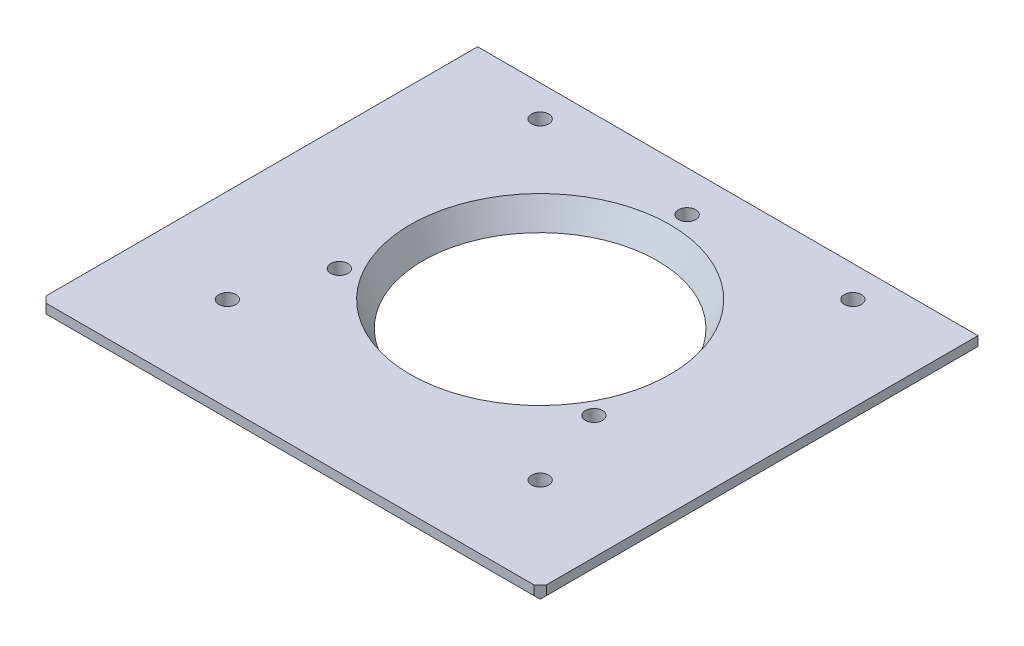
ISO-10303-21;
HEADER;
FILE_DESCRIPTION(('STEP AP214'),'2;1');
FILE_NAME('part.step','',(''),(''),'','','');
FILE_SCHEMA(('AUTOMOTIVE_DESIGN { 1 0 10303 214 1 1 1 1 }'));
ENDSEC;
DATA;
#1=APPLICATION_CONTEXT('core data for automotive mechanical design processes');
#2=APPLICATION_PROTOCOL_DEFINITION('international standard','automotive_design',2000,#1);
#3=PRODUCT_CONTEXT('',#1,'mechanical');
#4=PRODUCT('Part','Part','',(#3));
#5=PRODUCT_RELATED_PRODUCT_CATEGORY('part','',(#4));
#6=PRODUCT_DEFINITION_FORMATION('','',#4);
#7=PRODUCT_DEFINITION_CONTEXT('part definition',#1,'design');
#8=PRODUCT_DEFINITION('design','',#6,#7);
#9=PRODUCT_DEFINITION_SHAPE('','',#8);
#10=(LENGTH_UNIT() NAMED_UNIT(*) SI_UNIT(.MILLI.,.METRE.));
#11=(NAMED_UNIT(*) PLANE_ANGLE_UNIT() SI_UNIT($,.RADIAN.));
#12=(NAMED_UNIT(*) SI_UNIT($,.STERADIAN.) SOLID_ANGLE_UNIT());
#13=UNCERTAINTY_MEASURE_WITH_UNIT(LENGTH_MEASURE(1.E-05),#10,'distance_accuracy_value','');
#14=(GEOMETRIC_REPRESENTATION_CONTEXT(3) GLOBAL_UNCERTAINTY_ASSIGNED_CONTEXT((#13)) GLOBAL_UNIT_ASSIGNED_CONTEXT((#10,
#11,#12)) REPRESENTATION_CONTEXT('',''));
#15=CARTESIAN_POINT('',(0.,0.,0.));
#16=DIRECTION('',(0.,0.,1.));
#17=DIRECTION('',(1.,0.,0.));
#18=AXIS2_PLACEMENT_3D('',#15,#16,#17);
#19=CARTESIAN_POINT('',(40.,4.,0.));
#20=DIRECTION('',(-1.,0.,0.));
#21=DIRECTION('',(0.,0.,1.));
#22=AXIS2_PLACEMENT_3D('',#19,#20,#21);
#23=PLANE('',#22);
#24=DIRECTION('',(0.,-1.,0.));
#25=VECTOR('',#24,1.);
#26=CARTESIAN_POINT('',(40.,4.,39.));
#27=LINE('',#26,#25);
#28=CARTESIAN_POINT('',(40.,4.,39.));
#29=VERTEX_POINT('',#28);
#30=CARTESIAN_POINT('',(40.,2.5,39.));
#31=VERTEX_POINT('',#30);
#32=EDGE_CURVE('E220',#29,#31,#27,.T.);
#33=ORIENTED_EDGE('',*,*,#32,.T.);
#34=DIRECTION('',(0.,0.,-1.));
#35=VECTOR('',#34,1.);
#36=CARTESIAN_POINT('',(40.,2.5,0.));
#37=LINE('',#36,#35);
#38=CARTESIAN_POINT('',(40.,2.5,-30.));
#39=VERTEX_POINT('',#38);
#40=EDGE_CURVE('E140',#31,#39,#37,.T.);
#41=ORIENTED_EDGE('',*,*,#40,.T.);
#42=DIRECTION('',(0.,-1.,0.));
#43=VECTOR('',#42,1.);
#44=CARTESIAN_POINT('',(40.,4.,-30.));
#45=LINE('',#44,#43);
#46=CARTESIAN_POINT('',(40.,4.,-30.));
#47=VERTEX_POINT('',#46);
#48=EDGE_CURVE('E138',#47,#39,#45,.T.);
#49=ORIENTED_EDGE('',*,*,#48,.F.);
#50=DIRECTION('',(0.,0.,-1.));
#51=VECTOR('',#50,1.);
#52=CARTESIAN_POINT('',(40.,4.,0.));
#53=LINE('',#52,#51);
#54=EDGE_CURVE('E120',#29,#47,#53,.T.);
#55=ORIENTED_EDGE('',*,*,#54,.F.);
#56=EDGE_LOOP('',(#33,#41,#49,#55));
#57=FACE_BOUND('',#56,.T.);
#58=ADVANCED_FACE('F46',(#57),#23,.F.);
#59=CARTESIAN_POINT('',(0.,4.,-30.));
#60=DIRECTION('',(0.,0.,-1.));
#61=DIRECTION('',(-1.,0.,0.));
#62=AXIS2_PLACEMENT_3D('',#59,#60,#61);
#63=PLANE('',#62);
#64=ORIENTED_EDGE('',*,*,#48,.T.);
#65=DIRECTION('',(0.707106781186549,0.707106781186546,0.));
#66=VECTOR('',#65,1.);
#67=CARTESIAN_POINT('',(20.7499999999999,-16.75,-30.));
#68=LINE('',#67,#66);
#69=CARTESIAN_POINT('',(37.5,0.,-30.));
#70=VERTEX_POINT('',#69);
#71=EDGE_CURVE('E243',#39,#70,#68,.F.);
#72=ORIENTED_EDGE('',*,*,#71,.T.);
#73=DIRECTION('',(1.,0.,0.));
#74=VECTOR('',#73,1.);
#75=CARTESIAN_POINT('',(0.,0.,-30.));
#76=LINE('',#75,#74);
#77=CARTESIAN_POINT('',(-37.5,0.,-30.));
#78=VERTEX_POINT('',#77);
#79=EDGE_CURVE('E162',#78,#70,#76,.T.);
#80=ORIENTED_EDGE('',*,*,#79,.F.);
#81=DIRECTION('',(-0.707106781186548,0.707106781186548,0.));
#82=VECTOR('',#81,1.);
#83=CARTESIAN_POINT('',(-20.75,-16.75,-30.));
#84=LINE('',#83,#82);
#85=CARTESIAN_POINT('',(-40.,2.50000000000002,-30.));
#86=VERTEX_POINT('',#85);
#87=EDGE_CURVE('E240',#78,#86,#84,.T.);
#88=ORIENTED_EDGE('',*,*,#87,.T.);
#89=DIRECTION('',(0.,-1.,0.));
#90=VECTOR('',#89,1.);
#91=CARTESIAN_POINT('',(-40.,4.,-30.));
#92=LINE('',#91,#90);
#93=CARTESIAN_POINT('',(-40.,4.,-30.));
#94=VERTEX_POINT('',#93);
#95=EDGE_CURVE('E144',#94,#86,#92,.T.);
#96=ORIENTED_EDGE('',*,*,#95,.F.);
#97=DIRECTION('',(1.,0.,0.));
#98=VECTOR('',#97,1.);
#99=CARTESIAN_POINT('',(0.,4.,-30.));
#100=LINE('',#99,#98);
#101=EDGE_CURVE('E127',#94,#47,#100,.T.);
#102=ORIENTED_EDGE('',*,*,#101,.T.);
#103=EDGE_LOOP('',(#64,#72,#80,#88,#96,#102));
#104=FACE_BOUND('',#103,.T.);
#105=ADVANCED_FACE('F147',(#104),#63,.T.);
#106=CARTESIAN_POINT('',(-40.,4.,0.));
#107=DIRECTION('',(-1.,0.,0.));
#108=DIRECTION('',(0.,0.,1.));
#109=AXIS2_PLACEMENT_3D('',#106,#107,#108);
#110=PLANE('',#109);
#111=ORIENTED_EDGE('',*,*,#95,.T.);
#112=DIRECTION('',(0.,0.,1.));
#113=VECTOR('',#112,1.);
#114=CARTESIAN_POINT('',(-40.,2.50000000000002,39.));
#115=LINE('',#114,#113);
#116=CARTESIAN_POINT('',(-40.,2.50000000000002,39.));
#117=VERTEX_POINT('',#116);
#118=EDGE_CURVE('E11',#86,#117,#115,.T.);
#119=ORIENTED_EDGE('',*,*,#118,.T.);
#120=DIRECTION('',(0.,1.,0.));
#121=VECTOR('',#120,1.);
#122=CARTESIAN_POINT('',(-40.,4.,39.));
#123=LINE('',#122,#121);
#124=CARTESIAN_POINT('',(-40.,4.,39.));
#125=VERTEX_POINT('',#124);
#126=EDGE_CURVE('E235',#117,#125,#123,.T.);
#127=ORIENTED_EDGE('',*,*,#126,.T.);
#128=DIRECTION('',(0.,0.,-1.));
#129=VECTOR('',#128,1.);
#130=CARTESIAN_POINT('',(-40.,4.,0.));
#131=LINE('',#130,#129);
#132=EDGE_CURVE('E149',#125,#94,#131,.T.);
#133=ORIENTED_EDGE('',*,*,#132,.T.);
#134=EDGE_LOOP('',(#111,#119,#127,#133));
#135=FACE_BOUND('',#134,.T.);
#136=ADVANCED_FACE('F299',(#135),#110,.T.);
#137=CARTESIAN_POINT('',(0.,4.,-23.5));
#138=DIRECTION('',(0.,-1.,0.));
#139=DIRECTION('',(0.,0.,-1.));
#140=AXIS2_PLACEMENT_3D('',#137,#138,#139);
#141=CYLINDRICAL_SURFACE('',#140,1.375);
#142=CARTESIAN_POINT('',(0.,1.,-23.5));
#143=DIRECTION('',(0.,1.,0.));
#144=DIRECTION('',(0.,0.,1.));
#145=AXIS2_PLACEMENT_3D('',#142,#143,#144);
#146=CIRCLE('',#145,1.375);
#147=CARTESIAN_POINT('',(0.,1.,-22.125));
#148=VERTEX_POINT('',#147);
#149=EDGE_CURVE('E180',#148,#148,#146,.T.);
#150=ORIENTED_EDGE('',*,*,#149,.F.);
#151=EDGE_LOOP('',(#150));
#152=FACE_BOUND('',#151,.T.);
#153=CARTESIAN_POINT('',(0.,4.,-23.5));
#154=DIRECTION('',(0.,1.,0.));
#155=DIRECTION('',(0.,0.,1.));
#156=AXIS2_PLACEMENT_3D('',#153,#154,#155);
#157=CIRCLE('',#156,1.375);
#158=CARTESIAN_POINT('',(0.,4.,-22.125));
#159=VERTEX_POINT('',#158);
#160=EDGE_CURVE('E158',#159,#159,#157,.T.);
#161=ORIENTED_EDGE('',*,*,#160,.T.);
#162=EDGE_LOOP('',(#161));
#163=FACE_BOUND('',#162,.T.);
#164=ADVANCED_FACE('F301',(#152,#163),#141,.F.);
#165=CARTESIAN_POINT('',(0.,4.,40.));
#166=DIRECTION('',(0.,0.,-1.));
#167=DIRECTION('',(-1.,0.,0.));
#168=AXIS2_PLACEMENT_3D('',#165,#166,#167);
#169=PLANE('',#168);
#170=DIRECTION('',(0.,-1.,0.));
#171=VECTOR('',#170,1.);
#172=CARTESIAN_POINT('',(-39.,0.,40.));
#173=LINE('',#172,#171);
#174=CARTESIAN_POINT('',(-39.,4.,40.));
#175=VERTEX_POINT('',#174);
#176=CARTESIAN_POINT('',(-39.,2.5,40.));
#177=VERTEX_POINT('',#176);
#178=EDGE_CURVE('E223',#175,#177,#173,.T.);
#179=ORIENTED_EDGE('',*,*,#178,.T.);
#180=DIRECTION('',(1.,0.,0.));
#181=VECTOR('',#180,1.);
#182=CARTESIAN_POINT('',(0.,2.5,40.));
#183=LINE('',#182,#181);
#184=CARTESIAN_POINT('',(39.,2.5,40.));
#185=VERTEX_POINT('',#184);
#186=EDGE_CURVE('E261',#177,#185,#183,.T.);
#187=ORIENTED_EDGE('',*,*,#186,.T.);
#188=DIRECTION('',(0.,1.,0.));
#189=VECTOR('',#188,1.);
#190=CARTESIAN_POINT('',(39.,4.,40.));
#191=LINE('',#190,#189);
#192=CARTESIAN_POINT('',(39.,4.,40.));
#193=VERTEX_POINT('',#192);
#194=EDGE_CURVE('E227',#185,#193,#191,.T.);
#195=ORIENTED_EDGE('',*,*,#194,.T.);
#196=DIRECTION('',(1.,0.,0.));
#197=VECTOR('',#196,1.);
#198=CARTESIAN_POINT('',(0.,4.,40.));
#199=LINE('',#198,#197);
#200=EDGE_CURVE('E152',#175,#193,#199,.T.);
#201=ORIENTED_EDGE('',*,*,#200,.F.);
#202=EDGE_LOOP('',(#179,#187,#195,#201));
#203=FACE_BOUND('',#202,.T.);
#204=ADVANCED_FACE('F294',(#203),#169,.F.);
#205=CARTESIAN_POINT('',(-20.3515969889343,4.,11.75));
#206=DIRECTION('',(0.,-1.,0.));
#207=DIRECTION('',(0.,0.,-1.));
#208=AXIS2_PLACEMENT_3D('',#205,#206,#207);
#209=CYLINDRICAL_SURFACE('',#208,1.375);
#210=CARTESIAN_POINT('',(-20.3515969889343,1.,11.75));
#211=DIRECTION('',(0.,1.,0.));
#212=DIRECTION('',(0.,0.,1.));
#213=AXIS2_PLACEMENT_3D('',#210,#211,#212);
#214=CIRCLE('',#213,1.375);
#215=CARTESIAN_POINT('',(-20.3515969889343,1.,13.125));
#216=VERTEX_POINT('',#215);
#217=EDGE_CURVE('E176',#216,#216,#214,.T.);
#218=ORIENTED_EDGE('',*,*,#217,.F.);
#219=EDGE_LOOP('',(#218));
#220=FACE_BOUND('',#219,.T.);
#221=CARTESIAN_POINT('',(-20.3515969889343,4.,11.75));
#222=DIRECTION('',(0.,1.,0.));
#223=DIRECTION('',(0.,0.,1.));
#224=AXIS2_PLACEMENT_3D('',#221,#222,#223);
#225=CIRCLE('',#224,1.375);
#226=CARTESIAN_POINT('',(-20.3515969889343,4.,13.125));
#227=VERTEX_POINT('',#226);
#228=EDGE_CURVE('E134',#227,#227,#225,.T.);
#229=ORIENTED_EDGE('',*,*,#228,.T.);
#230=EDGE_LOOP('',(#229));
#231=FACE_BOUND('',#230,.T.);
#232=ADVANCED_FACE('F318',(#220,#231),#209,.F.);
#233=CARTESIAN_POINT('',(20.3515969889343,4.,11.7500000000001));
#234=DIRECTION('',(0.,-1.,0.));
#235=DIRECTION('',(0.,0.,-1.));
#236=AXIS2_PLACEMENT_3D('',#233,#234,#235);
#237=CYLINDRICAL_SURFACE('',#236,1.375);
#238=CARTESIAN_POINT('',(20.3515969889343,1.,11.7500000000001));
#239=DIRECTION('',(0.,1.,0.));
#240=DIRECTION('',(0.,0.,1.));
#241=AXIS2_PLACEMENT_3D('',#238,#239,#240);
#242=CIRCLE('',#241,1.375);
#243=CARTESIAN_POINT('',(20.3515969889343,1.,13.1250000000001));
#244=VERTEX_POINT('',#243);
#245=EDGE_CURVE('E184',#244,#244,#242,.T.);
#246=ORIENTED_EDGE('',*,*,#245,.F.);
#247=EDGE_LOOP('',(#246));
#248=FACE_BOUND('',#247,.T.);
#249=CARTESIAN_POINT('',(20.3515969889343,4.,11.7500000000001));
#250=DIRECTION('',(0.,1.,0.));
#251=DIRECTION('',(0.,0.,1.));
#252=AXIS2_PLACEMENT_3D('',#249,#250,#251);
#253=CIRCLE('',#252,1.375);
#254=CARTESIAN_POINT('',(20.3515969889343,4.,13.1250000000001));
#255=VERTEX_POINT('',#254);
#256=EDGE_CURVE('E664',#255,#255,#253,.T.);
#257=ORIENTED_EDGE('',*,*,#256,.T.);
#258=EDGE_LOOP('',(#257));
#259=FACE_BOUND('',#258,.T.);
#260=ADVANCED_FACE('F321',(#248,#259),#237,.F.);
#261=CARTESIAN_POINT('',(-25.,4.,25.));
#262=DIRECTION('',(0.,-1.,0.));
#263=DIRECTION('',(0.,0.,-1.));
#264=AXIS2_PLACEMENT_3D('',#261,#262,#263);
#265=CYLINDRICAL_SURFACE('',#264,1.375);
#266=CARTESIAN_POINT('',(-25.,0.5,25.));
#267=DIRECTION('',(0.,1.,0.));
#268=DIRECTION('',(0.,0.,1.));
#269=AXIS2_PLACEMENT_3D('',#266,#267,#268);
#270=CIRCLE('',#269,1.375);
#271=CARTESIAN_POINT('',(-25.,0.5,26.375));
#272=VERTEX_POINT('',#271);
#273=EDGE_CURVE('E204',#272,#272,#270,.F.);
#274=ORIENTED_EDGE('',*,*,#273,.T.);
#275=EDGE_LOOP('',(#274));
#276=FACE_BOUND('',#275,.T.);
#277=CARTESIAN_POINT('',(-25.,4.,25.));
#278=DIRECTION('',(0.,1.,0.));
#279=DIRECTION('',(0.,0.,1.));
#280=AXIS2_PLACEMENT_3D('',#277,#278,#279);
#281=CIRCLE('',#280,1.375);
#282=CARTESIAN_POINT('',(-25.,4.,26.375));
#283=VERTEX_POINT('',#282);
#284=EDGE_CURVE('E660',#283,#283,#281,.T.);
#285=ORIENTED_EDGE('',*,*,#284,.T.);
#286=EDGE_LOOP('',(#285));
#287=FACE_BOUND('',#286,.T.);
#288=ADVANCED_FACE('F325',(#276,#287),#265,.F.);
#289=CARTESIAN_POINT('',(-25.,4.,-25.));
#290=DIRECTION('',(0.,-1.,0.));
#291=DIRECTION('',(0.,0.,-1.));
#292=AXIS2_PLACEMENT_3D('',#289,#290,#291);
#293=CYLINDRICAL_SURFACE('',#292,1.375);
#294=CARTESIAN_POINT('',(-25.,0.5,-25.));
#295=DIRECTION('',(0.,1.,0.));
#296=DIRECTION('',(0.,0.,1.));
#297=AXIS2_PLACEMENT_3D('',#294,#295,#296);
#298=CIRCLE('',#297,1.375);
#299=CARTESIAN_POINT('',(-25.,0.5,-23.625));
#300=VERTEX_POINT('',#299);
#301=EDGE_CURVE('E212',#300,#300,#298,.F.);
#302=ORIENTED_EDGE('',*,*,#301,.T.);
#303=EDGE_LOOP('',(#302));
#304=FACE_BOUND('',#303,.T.);
#305=CARTESIAN_POINT('',(-25.,4.,-25.));
#306=DIRECTION('',(0.,1.,0.));
#307=DIRECTION('',(0.,0.,1.));
#308=AXIS2_PLACEMENT_3D('',#305,#306,#307);
#309=CIRCLE('',#308,1.375);
#310=CARTESIAN_POINT('',(-25.,4.,-23.625));
#311=VERTEX_POINT('',#310);
#312=EDGE_CURVE('E656',#311,#311,#309,.T.);
#313=ORIENTED_EDGE('',*,*,#312,.T.);
#314=EDGE_LOOP('',(#313));
#315=FACE_BOUND('',#314,.T.);
#316=ADVANCED_FACE('F329',(#304,#315),#293,.F.);
#317=CARTESIAN_POINT('',(25.,4.,-25.));
#318=DIRECTION('',(0.,-1.,0.));
#319=DIRECTION('',(0.,0.,-1.));
#320=AXIS2_PLACEMENT_3D('',#317,#318,#319);
#321=CYLINDRICAL_SURFACE('',#320,1.375);
#322=CARTESIAN_POINT('',(25.,0.5,-25.));
#323=DIRECTION('',(0.,1.,0.));
#324=DIRECTION('',(0.,0.,1.));
#325=AXIS2_PLACEMENT_3D('',#322,#323,#324);
#326=CIRCLE('',#325,1.375);
#327=CARTESIAN_POINT('',(25.,0.5,-23.625));
#328=VERTEX_POINT('',#327);
#329=EDGE_CURVE('E216',#328,#328,#326,.F.);
#330=ORIENTED_EDGE('',*,*,#329,.T.);
#331=EDGE_LOOP('',(#330));
#332=FACE_BOUND('',#331,.T.);
#333=CARTESIAN_POINT('',(25.,4.,-25.));
#334=DIRECTION('',(0.,1.,0.));
#335=DIRECTION('',(0.,0.,1.));
#336=AXIS2_PLACEMENT_3D('',#333,#334,#335);
#337=CIRCLE('',#336,1.375);
#338=CARTESIAN_POINT('',(25.,4.,-23.625));
#339=VERTEX_POINT('',#338);
#340=EDGE_CURVE('E652',#339,#339,#337,.T.);
#341=ORIENTED_EDGE('',*,*,#340,.T.);
#342=EDGE_LOOP('',(#341));
#343=FACE_BOUND('',#342,.T.);
#344=ADVANCED_FACE('F333',(#332,#343),#321,.F.);
#345=CARTESIAN_POINT('',(25.,4.,25.));
#346=DIRECTION('',(0.,-1.,0.));
#347=DIRECTION('',(0.,0.,-1.));
#348=AXIS2_PLACEMENT_3D('',#345,#346,#347);
#349=CYLINDRICAL_SURFACE('',#348,1.375);
#350=CARTESIAN_POINT('',(25.,0.5,25.));
#351=DIRECTION('',(0.,1.,0.));
#352=DIRECTION('',(0.,0.,1.));
#353=AXIS2_PLACEMENT_3D('',#350,#351,#352);
#354=CIRCLE('',#353,1.375);
#355=CARTESIAN_POINT('',(25.,0.5,26.375));
#356=VERTEX_POINT('',#355);
#357=EDGE_CURVE('E208',#356,#356,#354,.F.);
#358=ORIENTED_EDGE('',*,*,#357,.T.);
#359=EDGE_LOOP('',(#358));
#360=FACE_BOUND('',#359,.T.);
#361=CARTESIAN_POINT('',(25.,4.,25.));
#362=DIRECTION('',(0.,1.,0.));
#363=DIRECTION('',(0.,0.,1.));
#364=AXIS2_PLACEMENT_3D('',#361,#362,#363);
#365=CIRCLE('',#364,1.375);
#366=CARTESIAN_POINT('',(25.,4.,26.375));
#367=VERTEX_POINT('',#366);
#368=EDGE_CURVE('E170',#367,#367,#365,.T.);
#369=ORIENTED_EDGE('',*,*,#368,.T.);
#370=EDGE_LOOP('',(#369));
#371=FACE_BOUND('',#370,.T.);
#372=ADVANCED_FACE('F337',(#360,#371),#349,.F.);
#373=CARTESIAN_POINT('',(0.,4.,0.));
#374=DIRECTION('',(0.,1.,0.));
#375=DIRECTION('',(0.,0.,1.));
#376=AXIS2_PLACEMENT_3D('',#373,#374,#375);
#377=PLANE('',#376);
#378=CARTESIAN_POINT('',(0.,4.,0.));
#379=DIRECTION('',(0.,1.,0.));
#380=DIRECTION('',(0.,0.,1.));
#381=AXIS2_PLACEMENT_3D('',#378,#379,#380);
#382=CIRCLE('',#381,20.75);
#383=CARTESIAN_POINT('',(0.,4.,20.75));
#384=VERTEX_POINT('',#383);
#385=EDGE_CURVE('E143',#384,#384,#382,.F.);
#386=ORIENTED_EDGE('',*,*,#385,.T.);
#387=EDGE_LOOP('',(#386));
#388=FACE_BOUND('',#387,.T.);
#389=ORIENTED_EDGE('',*,*,#368,.F.);
#390=EDGE_LOOP('',(#389));
#391=FACE_BOUND('',#390,.T.);
#392=ORIENTED_EDGE('',*,*,#340,.F.);
#393=EDGE_LOOP('',(#392));
#394=FACE_BOUND('',#393,.T.);
#395=ORIENTED_EDGE('',*,*,#312,.F.);
#396=EDGE_LOOP('',(#395));
#397=FACE_BOUND('',#396,.T.);
#398=ORIENTED_EDGE('',*,*,#284,.F.);
#399=EDGE_LOOP('',(#398));
#400=FACE_BOUND('',#399,.T.);
#401=ORIENTED_EDGE('',*,*,#256,.F.);
#402=EDGE_LOOP('',(#401));
#403=FACE_BOUND('',#402,.T.);
#404=ORIENTED_EDGE('',*,*,#228,.F.);
#405=EDGE_LOOP('',(#404));
#406=FACE_BOUND('',#405,.T.);
#407=ORIENTED_EDGE('',*,*,#200,.T.);
#408=DIRECTION('',(-0.707106781186552,0.,0.707106781186543));
#409=VECTOR('',#408,1.);
#410=CARTESIAN_POINT('',(39.4999999999997,4.,39.5000000000003));
#411=LINE('',#410,#409);
#412=EDGE_CURVE('E129',#193,#29,#411,.F.);
#413=ORIENTED_EDGE('',*,*,#412,.T.);
#414=ORIENTED_EDGE('',*,*,#54,.T.);
#415=ORIENTED_EDGE('',*,*,#101,.F.);
#416=ORIENTED_EDGE('',*,*,#132,.F.);
#417=DIRECTION('',(0.707106781186543,0.,0.707106781186552));
#418=VECTOR('',#417,1.);
#419=CARTESIAN_POINT('',(-39.5000000000003,4.,39.4999999999997));
#420=LINE('',#419,#418);
#421=EDGE_CURVE('E230',#125,#175,#420,.T.);
#422=ORIENTED_EDGE('',*,*,#421,.T.);
#423=EDGE_LOOP('',(#407,#413,#414,#415,#416,#422));
#424=FACE_BOUND('',#423,.T.);
#425=ORIENTED_EDGE('',*,*,#160,.F.);
#426=EDGE_LOOP('',(#425));
#427=FACE_BOUND('',#426,.T.);
#428=ADVANCED_FACE('F123',(#388,#391,#394,#397,#400,#403,#406,#424,#427),#377,.T.);
#429=CARTESIAN_POINT('',(0.,0.,0.));
#430=DIRECTION('',(0.,1.,0.));
#431=DIRECTION('',(0.,0.,1.));
#432=AXIS2_PLACEMENT_3D('',#429,#430,#431);
#433=PLANE('',#432);
#434=CARTESIAN_POINT('',(-25.,0.,25.));
#435=DIRECTION('',(0.,1.,0.));
#436=DIRECTION('',(0.,0.,1.));
#437=AXIS2_PLACEMENT_3D('',#434,#435,#436);
#438=CIRCLE('',#437,1.875);
#439=CARTESIAN_POINT('',(-25.,0.,26.875));
#440=VERTEX_POINT('',#439);
#441=EDGE_CURVE('E200',#440,#440,#438,.T.);
#442=ORIENTED_EDGE('',*,*,#441,.T.);
#443=EDGE_LOOP('',(#442));
#444=FACE_BOUND('',#443,.T.);
#445=CARTESIAN_POINT('',(25.,0.,25.));
#446=DIRECTION('',(0.,1.,0.));
#447=DIRECTION('',(0.,0.,1.));
#448=AXIS2_PLACEMENT_3D('',#445,#446,#447);
#449=CIRCLE('',#448,1.875);
#450=CARTESIAN_POINT('',(25.,0.,26.875));
#451=VERTEX_POINT('',#450);
#452=EDGE_CURVE('E196',#451,#451,#449,.T.);
#453=ORIENTED_EDGE('',*,*,#452,.T.);
#454=EDGE_LOOP('',(#453));
#455=FACE_BOUND('',#454,.T.);
#456=CARTESIAN_POINT('',(-25.,0.,-25.));
#457=DIRECTION('',(0.,1.,0.));
#458=DIRECTION('',(0.,0.,1.));
#459=AXIS2_PLACEMENT_3D('',#456,#457,#458);
#460=CIRCLE('',#459,1.875);
#461=CARTESIAN_POINT('',(-25.,0.,-23.125));
#462=VERTEX_POINT('',#461);
#463=EDGE_CURVE('E192',#462,#462,#460,.T.);
#464=ORIENTED_EDGE('',*,*,#463,.T.);
#465=EDGE_LOOP('',(#464));
#466=FACE_BOUND('',#465,.T.);
#467=CARTESIAN_POINT('',(25.,0.,-25.));
#468=DIRECTION('',(0.,1.,0.));
#469=DIRECTION('',(0.,0.,1.));
#470=AXIS2_PLACEMENT_3D('',#467,#468,#469);
#471=CIRCLE('',#470,1.875);
#472=CARTESIAN_POINT('',(25.,0.,-23.125));
#473=VERTEX_POINT('',#472);
#474=EDGE_CURVE('E188',#473,#473,#471,.T.);
#475=ORIENTED_EDGE('',*,*,#474,.T.);
#476=EDGE_LOOP('',(#475));
#477=FACE_BOUND('',#476,.T.);
#478=ORIENTED_EDGE('',*,*,#79,.T.);
#479=DIRECTION('',(0.,0.,1.));
#480=VECTOR('',#479,1.);
#481=CARTESIAN_POINT('',(37.5,0.,0.));
#482=LINE('',#481,#480);
#483=CARTESIAN_POINT('',(37.5,0.,37.5));
#484=VERTEX_POINT('',#483);
#485=EDGE_CURVE('E252',#70,#484,#482,.T.);
#486=ORIENTED_EDGE('',*,*,#485,.T.);
#487=DIRECTION('',(-1.,0.,0.));
#488=VECTOR('',#487,1.);
#489=CARTESIAN_POINT('',(0.,0.,37.5));
#490=LINE('',#489,#488);
#491=CARTESIAN_POINT('',(-37.5,0.,37.5));
#492=VERTEX_POINT('',#491);
#493=EDGE_CURVE('E249',#484,#492,#490,.T.);
#494=ORIENTED_EDGE('',*,*,#493,.T.);
#495=DIRECTION('',(0.,0.,-1.));
#496=VECTOR('',#495,1.);
#497=CARTESIAN_POINT('',(-37.5,0.,-30.));
#498=LINE('',#497,#496);
#499=EDGE_CURVE('E246',#492,#78,#498,.T.);
#500=ORIENTED_EDGE('',*,*,#499,.T.);
#501=EDGE_LOOP('',(#478,#486,#494,#500));
#502=FACE_BOUND('',#501,.T.);
#503=CARTESIAN_POINT('',(0.,0.,0.));
#504=DIRECTION('',(0.,1.,0.));
#505=DIRECTION('',(0.,0.,1.));
#506=AXIS2_PLACEMENT_3D('',#503,#504,#505);
#507=CIRCLE('',#506,18.75);
#508=CARTESIAN_POINT('',(0.,0.,18.75));
#509=VERTEX_POINT('',#508);
#510=EDGE_CURVE('E166',#509,#509,#507,.T.);
#511=ORIENTED_EDGE('',*,*,#510,.T.);
#512=EDGE_LOOP('',(#511));
#513=FACE_BOUND('',#512,.T.);
#514=ADVANCED_FACE('F286',(#444,#455,#466,#477,#502,#513),#433,.F.);
#515=CARTESIAN_POINT('',(0.,0.,0.));
#516=DIRECTION('',(0.,1.,0.));
#517=DIRECTION('',(0.,0.,1.));
#518=AXIS2_PLACEMENT_3D('',#515,#516,#517);
#519=CONICAL_SURFACE('',#518,18.75,0.463647609000802);
#520=ORIENTED_EDGE('',*,*,#385,.F.);
#521=EDGE_LOOP('',(#520));
#522=FACE_BOUND('',#521,.T.);
#523=ORIENTED_EDGE('',*,*,#510,.F.);
#524=EDGE_LOOP('',(#523));
#525=FACE_BOUND('',#524,.T.);
#526=ADVANCED_FACE('F343',(#522,#525),#519,.F.);
#527=CARTESIAN_POINT('',(-20.3515969889343,1.,11.75));
#528=DIRECTION('',(0.,1.,0.));
#529=DIRECTION('',(0.,0.,1.));
#530=AXIS2_PLACEMENT_3D('',#527,#528,#529);
#531=PLANE('',#530);
#532=ORIENTED_EDGE('',*,*,#217,.T.);
#533=EDGE_LOOP('',(#532));
#534=FACE_BOUND('',#533,.T.);
#535=ADVANCED_FACE('F349',(#534),#531,.T.);
#536=CARTESIAN_POINT('',(0.,1.,-23.5));
#537=DIRECTION('',(0.,1.,0.));
#538=DIRECTION('',(0.,0.,1.));
#539=AXIS2_PLACEMENT_3D('',#536,#537,#538);
#540=PLANE('',#539);
#541=ORIENTED_EDGE('',*,*,#149,.T.);
#542=EDGE_LOOP('',(#541));
#543=FACE_BOUND('',#542,.T.);
#544=ADVANCED_FACE('F439',(#543),#540,.T.);
#545=CARTESIAN_POINT('',(20.3515969889343,1.,11.7500000000001));
#546=DIRECTION('',(0.,1.,0.));
#547=DIRECTION('',(0.,0.,1.));
#548=AXIS2_PLACEMENT_3D('',#545,#546,#547);
#549=PLANE('',#548);
#550=ORIENTED_EDGE('',*,*,#245,.T.);
#551=EDGE_LOOP('',(#550));
#552=FACE_BOUND('',#551,.T.);
#553=ADVANCED_FACE('F358',(#552),#549,.T.);
#554=CARTESIAN_POINT('',(-25.,0.,25.));
#555=DIRECTION('',(0.,-1.,0.));
#556=DIRECTION('',(0.,0.,-1.));
#557=AXIS2_PLACEMENT_3D('',#554,#555,#556);
#558=CONICAL_SURFACE('',#557,1.875,0.785398163397449);
#559=ORIENTED_EDGE('',*,*,#273,.F.);
#560=EDGE_LOOP('',(#559));
#561=FACE_BOUND('',#560,.T.);
#562=ORIENTED_EDGE('',*,*,#441,.F.);
#563=EDGE_LOOP('',(#562));
#564=FACE_BOUND('',#563,.T.);
#565=ADVANCED_FACE('F351',(#561,#564),#558,.F.);
#566=CARTESIAN_POINT('',(25.,0.,25.));
#567=DIRECTION('',(0.,-1.,0.));
#568=DIRECTION('',(0.,0.,-1.));
#569=AXIS2_PLACEMENT_3D('',#566,#567,#568);
#570=CONICAL_SURFACE('',#569,1.875,0.785398163397449);
#571=ORIENTED_EDGE('',*,*,#357,.F.);
#572=EDGE_LOOP('',(#571));
#573=FACE_BOUND('',#572,.T.);
#574=ORIENTED_EDGE('',*,*,#452,.F.);
#575=EDGE_LOOP('',(#574));
#576=FACE_BOUND('',#575,.T.);
#577=ADVANCED_FACE('F357',(#573,#576),#570,.F.);
#578=CARTESIAN_POINT('',(-25.,0.,-25.));
#579=DIRECTION('',(0.,-1.,0.));
#580=DIRECTION('',(0.,0.,-1.));
#581=AXIS2_PLACEMENT_3D('',#578,#579,#580);
#582=CONICAL_SURFACE('',#581,1.875,0.785398163397449);
#583=ORIENTED_EDGE('',*,*,#301,.F.);
#584=EDGE_LOOP('',(#583));
#585=FACE_BOUND('',#584,.T.);
#586=ORIENTED_EDGE('',*,*,#463,.F.);
#587=EDGE_LOOP('',(#586));
#588=FACE_BOUND('',#587,.T.);
#589=ADVANCED_FACE('F365',(#585,#588),#582,.F.);
#590=CARTESIAN_POINT('',(25.,0.,-25.));
#591=DIRECTION('',(0.,-1.,0.));
#592=DIRECTION('',(0.,0.,-1.));
#593=AXIS2_PLACEMENT_3D('',#590,#591,#592);
#594=CONICAL_SURFACE('',#593,1.875,0.785398163397449);
#595=ORIENTED_EDGE('',*,*,#329,.F.);
#596=EDGE_LOOP('',(#595));
#597=FACE_BOUND('',#596,.T.);
#598=ORIENTED_EDGE('',*,*,#474,.F.);
#599=EDGE_LOOP('',(#598));
#600=FACE_BOUND('',#599,.T.);
#601=ADVANCED_FACE('F372',(#597,#600),#594,.F.);
#602=CARTESIAN_POINT('',(40.,4.,39.));
#603=DIRECTION('',(-0.707106781186543,0.,-0.707106781186552));
#604=DIRECTION('',(0.,-1.,0.));
#605=AXIS2_PLACEMENT_3D('',#602,#603,#604);
#606=PLANE('',#605);
#607=DIRECTION('',(0.577350269189632,-0.577350269189621,-0.577350269189624));
#608=VECTOR('',#607,1.);
#609=CARTESIAN_POINT('',(39.1666666666667,2.33333333333333,39.8333333333333));
#610=LINE('',#609,#608);
#611=CARTESIAN_POINT('',(39.5,2.00000000000001,39.5));
#612=VERTEX_POINT('',#611);
#613=EDGE_CURVE('E255',#185,#612,#610,.T.);
#614=ORIENTED_EDGE('',*,*,#613,.T.);
#615=DIRECTION('',(0.577350269189629,0.577350269189626,-0.577350269189621));
#616=VECTOR('',#615,1.);
#617=CARTESIAN_POINT('',(40.5,3.,38.5));
#618=LINE('',#617,#616);
#619=EDGE_CURVE('E258',#612,#31,#618,.T.);
#620=ORIENTED_EDGE('',*,*,#619,.T.);
#621=ORIENTED_EDGE('',*,*,#32,.F.);
#622=ORIENTED_EDGE('',*,*,#412,.F.);
#623=ORIENTED_EDGE('',*,*,#194,.F.);
#624=EDGE_LOOP('',(#614,#620,#621,#622,#623));
#625=FACE_BOUND('',#624,.T.);
#626=ADVANCED_FACE('F290',(#625),#606,.F.);
#627=CARTESIAN_POINT('',(-39.,4.,40.));
#628=DIRECTION('',(-0.707106781186552,0.,0.707106781186543));
#629=DIRECTION('',(0.,1.,0.));
#630=AXIS2_PLACEMENT_3D('',#627,#628,#629);
#631=PLANE('',#630);
#632=DIRECTION('',(0.577350269189623,-0.577350269189623,0.577350269189631));
#633=VECTOR('',#632,1.);
#634=CARTESIAN_POINT('',(-39.8333333333333,2.33333333333334,39.1666666666667));
#635=LINE('',#634,#633);
#636=CARTESIAN_POINT('',(-39.5,2.00000000000002,39.5));
#637=VERTEX_POINT('',#636);
#638=EDGE_CURVE('E65',#117,#637,#635,.T.);
#639=ORIENTED_EDGE('',*,*,#638,.T.);
#640=DIRECTION('',(-0.577350269189621,-0.577350269189626,-0.577350269189629));
#641=VECTOR('',#640,1.);
#642=CARTESIAN_POINT('',(-38.5,3.,40.5));
#643=LINE('',#642,#641);
#644=EDGE_CURVE('E57',#637,#177,#643,.F.);
#645=ORIENTED_EDGE('',*,*,#644,.T.);
#646=ORIENTED_EDGE('',*,*,#178,.F.);
#647=ORIENTED_EDGE('',*,*,#421,.F.);
#648=ORIENTED_EDGE('',*,*,#126,.F.);
#649=EDGE_LOOP('',(#639,#645,#646,#647,#648));
#650=FACE_BOUND('',#649,.T.);
#651=ADVANCED_FACE('F298',(#650),#631,.T.);
#652=CARTESIAN_POINT('',(-37.5,0.,0.));
#653=DIRECTION('',(-0.707106781186547,-0.707106781186547,0.));
#654=DIRECTION('',(0.,0.,1.));
#655=AXIS2_PLACEMENT_3D('',#652,#653,#654);
#656=PLANE('',#655);
#657=ORIENTED_EDGE('',*,*,#87,.F.);
#658=ORIENTED_EDGE('',*,*,#499,.F.);
#659=DIRECTION('',(0.577350269189625,-0.577350269189625,-0.577350269189628));
#660=VECTOR('',#659,1.);
#661=CARTESIAN_POINT('',(-25.,-12.5,24.9999999999999));
#662=LINE('',#661,#660);
#663=EDGE_CURVE('E51',#637,#492,#662,.T.);
#664=ORIENTED_EDGE('',*,*,#663,.F.);
#665=ORIENTED_EDGE('',*,*,#638,.F.);
#666=ORIENTED_EDGE('',*,*,#118,.F.);
#667=EDGE_LOOP('',(#657,#658,#664,#665,#666));
#668=FACE_BOUND('',#667,.T.);
#669=ADVANCED_FACE('F49',(#668),#656,.T.);
#670=CARTESIAN_POINT('',(0.,2.5,40.));
#671=DIRECTION('',(0.,0.707106781186549,-0.707106781186545));
#672=DIRECTION('',(1.,0.,0.));
#673=AXIS2_PLACEMENT_3D('',#670,#671,#672);
#674=PLANE('',#673);
#675=ORIENTED_EDGE('',*,*,#663,.T.);
#676=ORIENTED_EDGE('',*,*,#493,.F.);
#677=DIRECTION('',(0.577350269189627,0.577350269189624,0.577350269189627));
#678=VECTOR('',#677,1.);
#679=CARTESIAN_POINT('',(26.6666666666666,-10.8333333333333,26.6666666666666));
#680=LINE('',#679,#678);
#681=EDGE_CURVE('E267',#612,#484,#680,.F.);
#682=ORIENTED_EDGE('',*,*,#681,.F.);
#683=ORIENTED_EDGE('',*,*,#613,.F.);
#684=ORIENTED_EDGE('',*,*,#186,.F.);
#685=ORIENTED_EDGE('',*,*,#644,.F.);
#686=EDGE_LOOP('',(#675,#676,#682,#683,#684,#685));
#687=FACE_BOUND('',#686,.T.);
#688=ADVANCED_FACE('F279',(#687),#674,.F.);
#689=CARTESIAN_POINT('',(40.,2.5,0.));
#690=DIRECTION('',(-0.707106781186545,0.707106781186549,0.));
#691=DIRECTION('',(0.,0.,-1.));
#692=AXIS2_PLACEMENT_3D('',#689,#690,#691);
#693=PLANE('',#692);
#694=ORIENTED_EDGE('',*,*,#681,.T.);
#695=ORIENTED_EDGE('',*,*,#485,.F.);
#696=ORIENTED_EDGE('',*,*,#71,.F.);
#697=ORIENTED_EDGE('',*,*,#40,.F.);
#698=ORIENTED_EDGE('',*,*,#619,.F.);
#699=EDGE_LOOP('',(#694,#695,#696,#697,#698));
#700=FACE_BOUND('',#699,.T.);
#701=ADVANCED_FACE('F288',(#700),#693,.F.);
#702=CLOSED_SHELL('',(#58,#105,#136,#164,#204,#232,#260,#288,#316,#344,#372,#428,#514,#526,#535,
#544,#553,#565,#577,#589,#601,#626,#651,#669,#688,#701));
#703=MANIFOLD_SOLID_BREP('B2',#702);
#704=ADVANCED_BREP_SHAPE_REPRESENTATION('',(#18,#703),#14);
#705=SHAPE_DEFINITION_REPRESENTATION(#9,#704);
ENDSEC;
END-ISO-10303-21;
